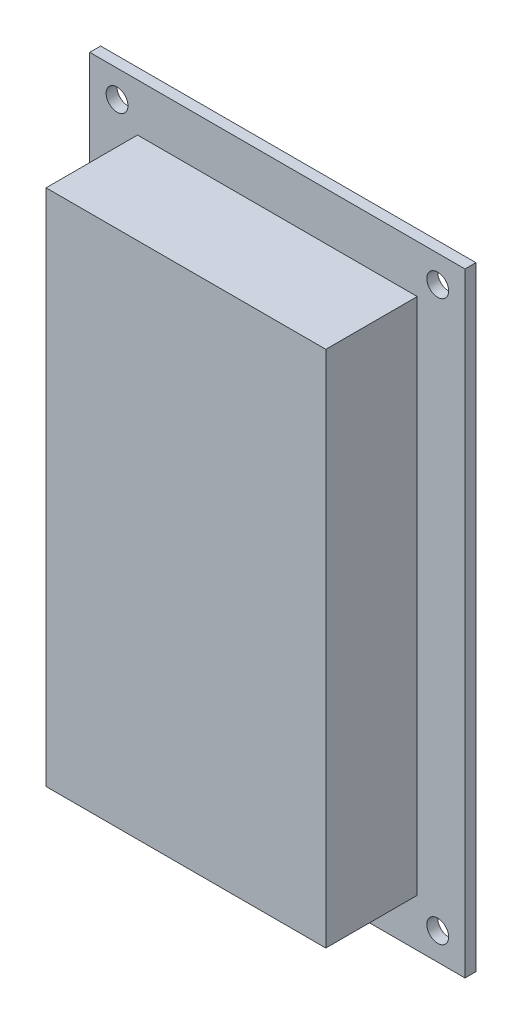
ISO-10303-21;
HEADER;
FILE_DESCRIPTION(('STEP AP214'),'2;1');
FILE_NAME('part.step','',(''),(''),'','','');
FILE_SCHEMA(('AUTOMOTIVE_DESIGN { 1 0 10303 214 1 1 1 1 }'));
ENDSEC;
DATA;
#1=APPLICATION_CONTEXT('core data for automotive mechanical design processes');
#2=APPLICATION_PROTOCOL_DEFINITION('international standard','automotive_design',2000,#1);
#3=PRODUCT_CONTEXT('',#1,'mechanical');
#4=PRODUCT('Part','Part','',(#3));
#5=PRODUCT_RELATED_PRODUCT_CATEGORY('part','',(#4));
#6=PRODUCT_DEFINITION_FORMATION('','',#4);
#7=PRODUCT_DEFINITION_CONTEXT('part definition',#1,'design');
#8=PRODUCT_DEFINITION('design','',#6,#7);
#9=PRODUCT_DEFINITION_SHAPE('','',#8);
#10=(LENGTH_UNIT() NAMED_UNIT(*) SI_UNIT(.MILLI.,.METRE.));
#11=(NAMED_UNIT(*) PLANE_ANGLE_UNIT() SI_UNIT($,.RADIAN.));
#12=(NAMED_UNIT(*) SI_UNIT($,.STERADIAN.) SOLID_ANGLE_UNIT());
#13=UNCERTAINTY_MEASURE_WITH_UNIT(LENGTH_MEASURE(1.E-05),#10,'distance_accuracy_value','');
#14=(GEOMETRIC_REPRESENTATION_CONTEXT(3) GLOBAL_UNCERTAINTY_ASSIGNED_CONTEXT((#13)) GLOBAL_UNIT_ASSIGNED_CONTEXT((#10,
#11,#12)) REPRESENTATION_CONTEXT('',''));
#15=CARTESIAN_POINT('',(0.,0.,0.));
#16=DIRECTION('',(0.,0.,1.));
#17=DIRECTION('',(1.,0.,0.));
#18=AXIS2_PLACEMENT_3D('',#15,#16,#17);
#19=CARTESIAN_POINT('',(-20.5,-38.,15.));
#20=DIRECTION('',(0.,0.,1.));
#21=DIRECTION('',(1.,0.,0.));
#22=AXIS2_PLACEMENT_3D('',#19,#20,#21);
#23=PLANE('',#22);
#24=DIRECTION('',(0.,1.,0.));
#25=VECTOR('',#24,1.);
#26=CARTESIAN_POINT('',(-20.5,-38.,15.));
#27=LINE('',#26,#25);
#28=CARTESIAN_POINT('',(-20.5,-38.,15.));
#29=VERTEX_POINT('',#28);
#30=CARTESIAN_POINT('',(-20.5,38.,15.));
#31=VERTEX_POINT('',#30);
#32=EDGE_CURVE('E157',#29,#31,#27,.T.);
#33=ORIENTED_EDGE('',*,*,#32,.F.);
#34=DIRECTION('',(1.,0.,0.));
#35=VECTOR('',#34,1.);
#36=CARTESIAN_POINT('',(-20.5,-38.,15.));
#37=LINE('',#36,#35);
#38=CARTESIAN_POINT('',(20.5,-38.,15.));
#39=VERTEX_POINT('',#38);
#40=EDGE_CURVE('E115',#29,#39,#37,.T.);
#41=ORIENTED_EDGE('',*,*,#40,.T.);
#42=DIRECTION('',(0.,1.,0.));
#43=VECTOR('',#42,1.);
#44=CARTESIAN_POINT('',(20.5,-38.,15.));
#45=LINE('',#44,#43);
#46=CARTESIAN_POINT('',(20.5,38.,15.));
#47=VERTEX_POINT('',#46);
#48=EDGE_CURVE('E224',#39,#47,#45,.T.);
#49=ORIENTED_EDGE('',*,*,#48,.T.);
#50=DIRECTION('',(1.,0.,0.));
#51=VECTOR('',#50,1.);
#52=CARTESIAN_POINT('',(-20.5,38.,15.));
#53=LINE('',#52,#51);
#54=EDGE_CURVE('E25',#31,#47,#53,.T.);
#55=ORIENTED_EDGE('',*,*,#54,.F.);
#56=EDGE_LOOP('',(#33,#41,#49,#55));
#57=FACE_BOUND('',#56,.T.);
#58=ADVANCED_FACE('F14',(#57),#23,.T.);
#59=CARTESIAN_POINT('',(23.5,41.,-2.5));
#60=DIRECTION('',(0.,0.,1.));
#61=DIRECTION('',(1.,0.,0.));
#62=AXIS2_PLACEMENT_3D('',#59,#60,#61);
#63=CYLINDRICAL_SURFACE('',#62,1.6);
#64=DIRECTION('',(0.,0.,1.));
#65=VECTOR('',#64,1.);
#66=CARTESIAN_POINT('',(25.1,41.,-2.5));
#67=LINE('',#66,#65);
#68=CARTESIAN_POINT('',(25.1,41.,0.));
#69=VERTEX_POINT('',#68);
#70=CARTESIAN_POINT('',(25.1,41.,1.6));
#71=VERTEX_POINT('',#70);
#72=EDGE_CURVE('E9',#69,#71,#67,.T.);
#73=ORIENTED_EDGE('',*,*,#72,.F.);
#74=CARTESIAN_POINT('',(23.5,41.,0.));
#75=DIRECTION('',(0.,0.,1.));
#76=DIRECTION('',(1.,0.,0.));
#77=AXIS2_PLACEMENT_3D('',#74,#75,#76);
#78=CIRCLE('',#77,1.6);
#79=EDGE_CURVE('E196',#69,#69,#78,.T.);
#80=ORIENTED_EDGE('',*,*,#79,.F.);
#81=ORIENTED_EDGE('',*,*,#72,.T.);
#82=CARTESIAN_POINT('',(23.5,41.,1.6));
#83=DIRECTION('',(0.,0.,1.));
#84=DIRECTION('',(1.,0.,0.));
#85=AXIS2_PLACEMENT_3D('',#82,#83,#84);
#86=CIRCLE('',#85,1.6);
#87=EDGE_CURVE('E185',#71,#71,#86,.T.);
#88=ORIENTED_EDGE('',*,*,#87,.T.);
#89=EDGE_LOOP('',(#73,#80,#81,#88));
#90=FACE_BOUND('',#89,.T.);
#91=ADVANCED_FACE('F303',(#90),#63,.F.);
#92=CARTESIAN_POINT('',(-20.5,38.,1.6));
#93=DIRECTION('',(0.,1.,0.));
#94=DIRECTION('',(1.,0.,0.));
#95=AXIS2_PLACEMENT_3D('',#92,#93,#94);
#96=PLANE('',#95);
#97=DIRECTION('',(1.,0.,0.));
#98=VECTOR('',#97,1.);
#99=CARTESIAN_POINT('',(-20.5,38.,1.6));
#100=LINE('',#99,#98);
#101=CARTESIAN_POINT('',(-20.5,38.,1.6));
#102=VERTEX_POINT('',#101);
#103=CARTESIAN_POINT('',(20.5,38.,1.6));
#104=VERTEX_POINT('',#103);
#105=EDGE_CURVE('E162',#102,#104,#100,.T.);
#106=ORIENTED_EDGE('',*,*,#105,.F.);
#107=DIRECTION('',(0.,0.,1.));
#108=VECTOR('',#107,1.);
#109=CARTESIAN_POINT('',(-20.5,38.,1.6));
#110=LINE('',#109,#108);
#111=EDGE_CURVE('E153',#102,#31,#110,.T.);
#112=ORIENTED_EDGE('',*,*,#111,.T.);
#113=ORIENTED_EDGE('',*,*,#54,.T.);
#114=DIRECTION('',(0.,0.,1.));
#115=VECTOR('',#114,1.);
#116=CARTESIAN_POINT('',(20.5,38.,1.6));
#117=LINE('',#116,#115);
#118=EDGE_CURVE('E147',#104,#47,#117,.T.);
#119=ORIENTED_EDGE('',*,*,#118,.F.);
#120=EDGE_LOOP('',(#106,#112,#113,#119));
#121=FACE_BOUND('',#120,.T.);
#122=ADVANCED_FACE('F16',(#121),#96,.T.);
#123=CARTESIAN_POINT('',(20.5,-38.,1.6));
#124=DIRECTION('',(1.,0.,0.));
#125=DIRECTION('',(0.,1.,0.));
#126=AXIS2_PLACEMENT_3D('',#123,#124,#125);
#127=PLANE('',#126);
#128=DIRECTION('',(0.,0.,1.));
#129=VECTOR('',#128,1.);
#130=CARTESIAN_POINT('',(20.5,-38.,1.6));
#131=LINE('',#130,#129);
#132=CARTESIAN_POINT('',(20.5,-38.,1.6));
#133=VERTEX_POINT('',#132);
#134=EDGE_CURVE('E142',#133,#39,#131,.T.);
#135=ORIENTED_EDGE('',*,*,#134,.F.);
#136=DIRECTION('',(0.,1.,0.));
#137=VECTOR('',#136,1.);
#138=CARTESIAN_POINT('',(20.5,-38.,1.6));
#139=LINE('',#138,#137);
#140=EDGE_CURVE('E166',#133,#104,#139,.T.);
#141=ORIENTED_EDGE('',*,*,#140,.T.);
#142=ORIENTED_EDGE('',*,*,#118,.T.);
#143=ORIENTED_EDGE('',*,*,#48,.F.);
#144=EDGE_LOOP('',(#135,#141,#142,#143));
#145=FACE_BOUND('',#144,.T.);
#146=ADVANCED_FACE('F301',(#145),#127,.T.);
#147=CARTESIAN_POINT('',(-20.5,-38.,1.6));
#148=DIRECTION('',(0.,1.,0.));
#149=DIRECTION('',(1.,0.,0.));
#150=AXIS2_PLACEMENT_3D('',#147,#148,#149);
#151=PLANE('',#150);
#152=ORIENTED_EDGE('',*,*,#134,.T.);
#153=ORIENTED_EDGE('',*,*,#40,.F.);
#154=DIRECTION('',(0.,0.,1.));
#155=VECTOR('',#154,1.);
#156=CARTESIAN_POINT('',(-20.5,-38.,1.6));
#157=LINE('',#156,#155);
#158=CARTESIAN_POINT('',(-20.5,-38.,1.6));
#159=VERTEX_POINT('',#158);
#160=EDGE_CURVE('E159',#159,#29,#157,.T.);
#161=ORIENTED_EDGE('',*,*,#160,.F.);
#162=DIRECTION('',(1.,0.,0.));
#163=VECTOR('',#162,1.);
#164=CARTESIAN_POINT('',(-20.5,-38.,1.6));
#165=LINE('',#164,#163);
#166=EDGE_CURVE('E171',#159,#133,#165,.T.);
#167=ORIENTED_EDGE('',*,*,#166,.T.);
#168=EDGE_LOOP('',(#152,#153,#161,#167));
#169=FACE_BOUND('',#168,.T.);
#170=ADVANCED_FACE('F300',(#169),#151,.F.);
#171=CARTESIAN_POINT('',(-20.5,-38.,1.6));
#172=DIRECTION('',(1.,0.,0.));
#173=DIRECTION('',(0.,1.,0.));
#174=AXIS2_PLACEMENT_3D('',#171,#172,#173);
#175=PLANE('',#174);
#176=ORIENTED_EDGE('',*,*,#32,.T.);
#177=ORIENTED_EDGE('',*,*,#111,.F.);
#178=DIRECTION('',(0.,1.,0.));
#179=VECTOR('',#178,1.);
#180=CARTESIAN_POINT('',(-20.5,-38.,1.6));
#181=LINE('',#180,#179);
#182=EDGE_CURVE('E156',#159,#102,#181,.T.);
#183=ORIENTED_EDGE('',*,*,#182,.F.);
#184=ORIENTED_EDGE('',*,*,#160,.T.);
#185=EDGE_LOOP('',(#176,#177,#183,#184));
#186=FACE_BOUND('',#185,.T.);
#187=ADVANCED_FACE('F154',(#186),#175,.F.);
#188=CARTESIAN_POINT('',(-23.5,41.,-2.5));
#189=DIRECTION('',(0.,0.,1.));
#190=DIRECTION('',(1.,0.,0.));
#191=AXIS2_PLACEMENT_3D('',#188,#189,#190);
#192=CYLINDRICAL_SURFACE('',#191,1.6);
#193=DIRECTION('',(0.,0.,1.));
#194=VECTOR('',#193,1.);
#195=CARTESIAN_POINT('',(-21.9,41.,-2.5));
#196=LINE('',#195,#194);
#197=CARTESIAN_POINT('',(-21.9,41.,0.));
#198=VERTEX_POINT('',#197);
#199=CARTESIAN_POINT('',(-21.9,41.,1.6));
#200=VERTEX_POINT('',#199);
#201=EDGE_CURVE('E202',#198,#200,#196,.T.);
#202=ORIENTED_EDGE('',*,*,#201,.F.);
#203=CARTESIAN_POINT('',(-23.5,41.,0.));
#204=DIRECTION('',(0.,0.,1.));
#205=DIRECTION('',(1.,0.,0.));
#206=AXIS2_PLACEMENT_3D('',#203,#204,#205);
#207=CIRCLE('',#206,1.6);
#208=EDGE_CURVE('E251',#198,#198,#207,.T.);
#209=ORIENTED_EDGE('',*,*,#208,.F.);
#210=ORIENTED_EDGE('',*,*,#201,.T.);
#211=CARTESIAN_POINT('',(-23.5,41.,1.6));
#212=DIRECTION('',(0.,0.,1.));
#213=DIRECTION('',(1.,0.,0.));
#214=AXIS2_PLACEMENT_3D('',#211,#212,#213);
#215=CIRCLE('',#214,1.6);
#216=EDGE_CURVE('E173',#200,#200,#215,.T.);
#217=ORIENTED_EDGE('',*,*,#216,.T.);
#218=EDGE_LOOP('',(#202,#209,#210,#217));
#219=FACE_BOUND('',#218,.T.);
#220=ADVANCED_FACE('F316',(#219),#192,.F.);
#221=CARTESIAN_POINT('',(23.5,-41.,-2.5));
#222=DIRECTION('',(0.,0.,1.));
#223=DIRECTION('',(1.,0.,0.));
#224=AXIS2_PLACEMENT_3D('',#221,#222,#223);
#225=CYLINDRICAL_SURFACE('',#224,1.6);
#226=DIRECTION('',(0.,0.,1.));
#227=VECTOR('',#226,1.);
#228=CARTESIAN_POINT('',(25.1,-41.,-2.5));
#229=LINE('',#228,#227);
#230=CARTESIAN_POINT('',(25.1,-41.,0.));
#231=VERTEX_POINT('',#230);
#232=CARTESIAN_POINT('',(25.1,-41.,1.6));
#233=VERTEX_POINT('',#232);
#234=EDGE_CURVE('E94',#231,#233,#229,.T.);
#235=ORIENTED_EDGE('',*,*,#234,.F.);
#236=CARTESIAN_POINT('',(23.5,-41.,0.));
#237=DIRECTION('',(0.,0.,1.));
#238=DIRECTION('',(1.,0.,0.));
#239=AXIS2_PLACEMENT_3D('',#236,#237,#238);
#240=CIRCLE('',#239,1.6);
#241=EDGE_CURVE('E18',#231,#231,#240,.T.);
#242=ORIENTED_EDGE('',*,*,#241,.F.);
#243=ORIENTED_EDGE('',*,*,#234,.T.);
#244=CARTESIAN_POINT('',(23.5,-41.,1.6));
#245=DIRECTION('',(0.,0.,1.));
#246=DIRECTION('',(1.,0.,0.));
#247=AXIS2_PLACEMENT_3D('',#244,#245,#246);
#248=CIRCLE('',#247,1.6);
#249=EDGE_CURVE('E180',#233,#233,#248,.T.);
#250=ORIENTED_EDGE('',*,*,#249,.T.);
#251=EDGE_LOOP('',(#235,#242,#243,#250));
#252=FACE_BOUND('',#251,.T.);
#253=ADVANCED_FACE('F313',(#252),#225,.F.);
#254=CARTESIAN_POINT('',(-23.5,-41.,-2.5));
#255=DIRECTION('',(0.,0.,1.));
#256=DIRECTION('',(1.,0.,0.));
#257=AXIS2_PLACEMENT_3D('',#254,#255,#256);
#258=CYLINDRICAL_SURFACE('',#257,1.6);
#259=DIRECTION('',(0.,0.,1.));
#260=VECTOR('',#259,1.);
#261=CARTESIAN_POINT('',(-21.9,-41.,-2.5));
#262=LINE('',#261,#260);
#263=CARTESIAN_POINT('',(-21.9,-41.,0.));
#264=VERTEX_POINT('',#263);
#265=CARTESIAN_POINT('',(-21.9,-41.,1.6));
#266=VERTEX_POINT('',#265);
#267=EDGE_CURVE('E82',#264,#266,#262,.T.);
#268=ORIENTED_EDGE('',*,*,#267,.F.);
#269=CARTESIAN_POINT('',(-23.5,-41.,0.));
#270=DIRECTION('',(0.,0.,1.));
#271=DIRECTION('',(1.,0.,0.));
#272=AXIS2_PLACEMENT_3D('',#269,#270,#271);
#273=CIRCLE('',#272,1.6);
#274=EDGE_CURVE('E197',#264,#264,#273,.T.);
#275=ORIENTED_EDGE('',*,*,#274,.F.);
#276=ORIENTED_EDGE('',*,*,#267,.T.);
#277=CARTESIAN_POINT('',(-23.5,-41.,1.6));
#278=DIRECTION('',(0.,0.,1.));
#279=DIRECTION('',(1.,0.,0.));
#280=AXIS2_PLACEMENT_3D('',#277,#278,#279);
#281=CIRCLE('',#280,1.6);
#282=EDGE_CURVE('E190',#266,#266,#281,.T.);
#283=ORIENTED_EDGE('',*,*,#282,.T.);
#284=EDGE_LOOP('',(#268,#275,#276,#283));
#285=FACE_BOUND('',#284,.T.);
#286=ADVANCED_FACE('F315',(#285),#258,.F.);
#287=CARTESIAN_POINT('',(27.5,-45.,0.));
#288=DIRECTION('',(1.,0.,0.));
#289=DIRECTION('',(0.,1.,0.));
#290=AXIS2_PLACEMENT_3D('',#287,#288,#289);
#291=PLANE('',#290);
#292=DIRECTION('',(0.,0.,1.));
#293=VECTOR('',#292,1.);
#294=CARTESIAN_POINT('',(27.5,-45.,0.));
#295=LINE('',#294,#293);
#296=CARTESIAN_POINT('',(27.5,-45.,0.));
#297=VERTEX_POINT('',#296);
#298=CARTESIAN_POINT('',(27.5,-45.,1.6));
#299=VERTEX_POINT('',#298);
#300=EDGE_CURVE('E215',#297,#299,#295,.T.);
#301=ORIENTED_EDGE('',*,*,#300,.F.);
#302=DIRECTION('',(0.,1.,0.));
#303=VECTOR('',#302,1.);
#304=CARTESIAN_POINT('',(27.5,-45.,0.));
#305=LINE('',#304,#303);
#306=CARTESIAN_POINT('',(27.5,45.,0.));
#307=VERTEX_POINT('',#306);
#308=EDGE_CURVE('E200',#297,#307,#305,.T.);
#309=ORIENTED_EDGE('',*,*,#308,.T.);
#310=DIRECTION('',(0.,0.,1.));
#311=VECTOR('',#310,1.);
#312=CARTESIAN_POINT('',(27.5,45.,0.));
#313=LINE('',#312,#311);
#314=CARTESIAN_POINT('',(27.5,45.,1.6));
#315=VERTEX_POINT('',#314);
#316=EDGE_CURVE('E221',#307,#315,#313,.T.);
#317=ORIENTED_EDGE('',*,*,#316,.T.);
#318=DIRECTION('',(0.,1.,0.));
#319=VECTOR('',#318,1.);
#320=CARTESIAN_POINT('',(27.5,-45.,1.6));
#321=LINE('',#320,#319);
#322=EDGE_CURVE('E206',#299,#315,#321,.T.);
#323=ORIENTED_EDGE('',*,*,#322,.F.);
#324=EDGE_LOOP('',(#301,#309,#317,#323));
#325=FACE_BOUND('',#324,.T.);
#326=ADVANCED_FACE('F272',(#325),#291,.T.);
#327=CARTESIAN_POINT('',(-27.5,-45.,0.));
#328=DIRECTION('',(0.,0.,1.));
#329=DIRECTION('',(1.,0.,0.));
#330=AXIS2_PLACEMENT_3D('',#327,#328,#329);
#331=PLANE('',#330);
#332=ORIENTED_EDGE('',*,*,#79,.T.);
#333=EDGE_LOOP('',(#332));
#334=FACE_BOUND('',#333,.T.);
#335=ORIENTED_EDGE('',*,*,#208,.T.);
#336=EDGE_LOOP('',(#335));
#337=FACE_BOUND('',#336,.T.);
#338=ORIENTED_EDGE('',*,*,#241,.T.);
#339=EDGE_LOOP('',(#338));
#340=FACE_BOUND('',#339,.T.);
#341=ORIENTED_EDGE('',*,*,#274,.T.);
#342=EDGE_LOOP('',(#341));
#343=FACE_BOUND('',#342,.T.);
#344=DIRECTION('',(1.,0.,0.));
#345=VECTOR('',#344,1.);
#346=CARTESIAN_POINT('',(-27.5,45.,0.));
#347=LINE('',#346,#345);
#348=CARTESIAN_POINT('',(-27.5,45.,0.));
#349=VERTEX_POINT('',#348);
#350=EDGE_CURVE('E189',#349,#307,#347,.T.);
#351=ORIENTED_EDGE('',*,*,#350,.T.);
#352=ORIENTED_EDGE('',*,*,#308,.F.);
#353=DIRECTION('',(1.,0.,0.));
#354=VECTOR('',#353,1.);
#355=CARTESIAN_POINT('',(-27.5,-45.,0.));
#356=LINE('',#355,#354);
#357=CARTESIAN_POINT('',(-27.5,-45.,0.));
#358=VERTEX_POINT('',#357);
#359=EDGE_CURVE('E210',#358,#297,#356,.T.);
#360=ORIENTED_EDGE('',*,*,#359,.F.);
#361=DIRECTION('',(0.,1.,0.));
#362=VECTOR('',#361,1.);
#363=CARTESIAN_POINT('',(-27.5,-45.,0.));
#364=LINE('',#363,#362);
#365=EDGE_CURVE('E229',#358,#349,#364,.T.);
#366=ORIENTED_EDGE('',*,*,#365,.T.);
#367=EDGE_LOOP('',(#351,#352,#360,#366));
#368=FACE_BOUND('',#367,.T.);
#369=ADVANCED_FACE('F275',(#334,#337,#340,#343,#368),#331,.F.);
#370=CARTESIAN_POINT('',(-27.5,45.,0.));
#371=DIRECTION('',(0.,1.,0.));
#372=DIRECTION('',(1.,0.,0.));
#373=AXIS2_PLACEMENT_3D('',#370,#371,#372);
#374=PLANE('',#373);
#375=ORIENTED_EDGE('',*,*,#350,.F.);
#376=DIRECTION('',(0.,0.,1.));
#377=VECTOR('',#376,1.);
#378=CARTESIAN_POINT('',(-27.5,45.,0.));
#379=LINE('',#378,#377);
#380=CARTESIAN_POINT('',(-27.5,45.,1.6));
#381=VERTEX_POINT('',#380);
#382=EDGE_CURVE('E234',#349,#381,#379,.T.);
#383=ORIENTED_EDGE('',*,*,#382,.T.);
#384=DIRECTION('',(1.,0.,0.));
#385=VECTOR('',#384,1.);
#386=CARTESIAN_POINT('',(-27.5,45.,1.6));
#387=LINE('',#386,#385);
#388=EDGE_CURVE('E193',#381,#315,#387,.T.);
#389=ORIENTED_EDGE('',*,*,#388,.T.);
#390=ORIENTED_EDGE('',*,*,#316,.F.);
#391=EDGE_LOOP('',(#375,#383,#389,#390));
#392=FACE_BOUND('',#391,.T.);
#393=ADVANCED_FACE('F265',(#392),#374,.T.);
#394=CARTESIAN_POINT('',(-27.5,-45.,1.6));
#395=DIRECTION('',(0.,0.,1.));
#396=DIRECTION('',(1.,0.,0.));
#397=AXIS2_PLACEMENT_3D('',#394,#395,#396);
#398=PLANE('',#397);
#399=ORIENTED_EDGE('',*,*,#87,.F.);
#400=EDGE_LOOP('',(#399));
#401=FACE_BOUND('',#400,.T.);
#402=ORIENTED_EDGE('',*,*,#182,.T.);
#403=ORIENTED_EDGE('',*,*,#105,.T.);
#404=ORIENTED_EDGE('',*,*,#140,.F.);
#405=ORIENTED_EDGE('',*,*,#166,.F.);
#406=EDGE_LOOP('',(#402,#403,#404,#405));
#407=FACE_BOUND('',#406,.T.);
#408=ORIENTED_EDGE('',*,*,#216,.F.);
#409=EDGE_LOOP('',(#408));
#410=FACE_BOUND('',#409,.T.);
#411=ORIENTED_EDGE('',*,*,#249,.F.);
#412=EDGE_LOOP('',(#411));
#413=FACE_BOUND('',#412,.T.);
#414=ORIENTED_EDGE('',*,*,#282,.F.);
#415=EDGE_LOOP('',(#414));
#416=FACE_BOUND('',#415,.T.);
#417=DIRECTION('',(0.,1.,0.));
#418=VECTOR('',#417,1.);
#419=CARTESIAN_POINT('',(-27.5,-45.,1.6));
#420=LINE('',#419,#418);
#421=CARTESIAN_POINT('',(-27.5,-45.,1.6));
#422=VERTEX_POINT('',#421);
#423=EDGE_CURVE('E255',#422,#381,#420,.T.);
#424=ORIENTED_EDGE('',*,*,#423,.F.);
#425=DIRECTION('',(1.,0.,0.));
#426=VECTOR('',#425,1.);
#427=CARTESIAN_POINT('',(-27.5,-45.,1.6));
#428=LINE('',#427,#426);
#429=EDGE_CURVE('E211',#422,#299,#428,.T.);
#430=ORIENTED_EDGE('',*,*,#429,.T.);
#431=ORIENTED_EDGE('',*,*,#322,.T.);
#432=ORIENTED_EDGE('',*,*,#388,.F.);
#433=EDGE_LOOP('',(#424,#430,#431,#432));
#434=FACE_BOUND('',#433,.T.);
#435=ADVANCED_FACE('F169',(#401,#407,#410,#413,#416,#434),#398,.T.);
#436=CARTESIAN_POINT('',(-27.5,-45.,0.));
#437=DIRECTION('',(0.,1.,0.));
#438=DIRECTION('',(1.,0.,0.));
#439=AXIS2_PLACEMENT_3D('',#436,#437,#438);
#440=PLANE('',#439);
#441=ORIENTED_EDGE('',*,*,#300,.T.);
#442=ORIENTED_EDGE('',*,*,#429,.F.);
#443=DIRECTION('',(0.,0.,1.));
#444=VECTOR('',#443,1.);
#445=CARTESIAN_POINT('',(-27.5,-45.,0.));
#446=LINE('',#445,#444);
#447=EDGE_CURVE('E233',#358,#422,#446,.T.);
#448=ORIENTED_EDGE('',*,*,#447,.F.);
#449=ORIENTED_EDGE('',*,*,#359,.T.);
#450=EDGE_LOOP('',(#441,#442,#448,#449));
#451=FACE_BOUND('',#450,.T.);
#452=ADVANCED_FACE('F278',(#451),#440,.F.);
#453=CARTESIAN_POINT('',(-27.5,-45.,0.));
#454=DIRECTION('',(1.,0.,0.));
#455=DIRECTION('',(0.,1.,0.));
#456=AXIS2_PLACEMENT_3D('',#453,#454,#455);
#457=PLANE('',#456);
#458=ORIENTED_EDGE('',*,*,#423,.T.);
#459=ORIENTED_EDGE('',*,*,#382,.F.);
#460=ORIENTED_EDGE('',*,*,#365,.F.);
#461=ORIENTED_EDGE('',*,*,#447,.T.);
#462=EDGE_LOOP('',(#458,#459,#460,#461));
#463=FACE_BOUND('',#462,.T.);
#464=ADVANCED_FACE('F286',(#463),#457,.F.);
#465=CLOSED_SHELL('',(#58,#91,#122,#146,#170,#187,#220,#253,#286,#326,#369,#393,#435,#452,#464));
#466=MANIFOLD_SOLID_BREP('B1',#465);
#467=ADVANCED_BREP_SHAPE_REPRESENTATION('',(#18,#466),#14);
#468=SHAPE_DEFINITION_REPRESENTATION(#9,#467);
ENDSEC;
END-ISO-10303-21;
